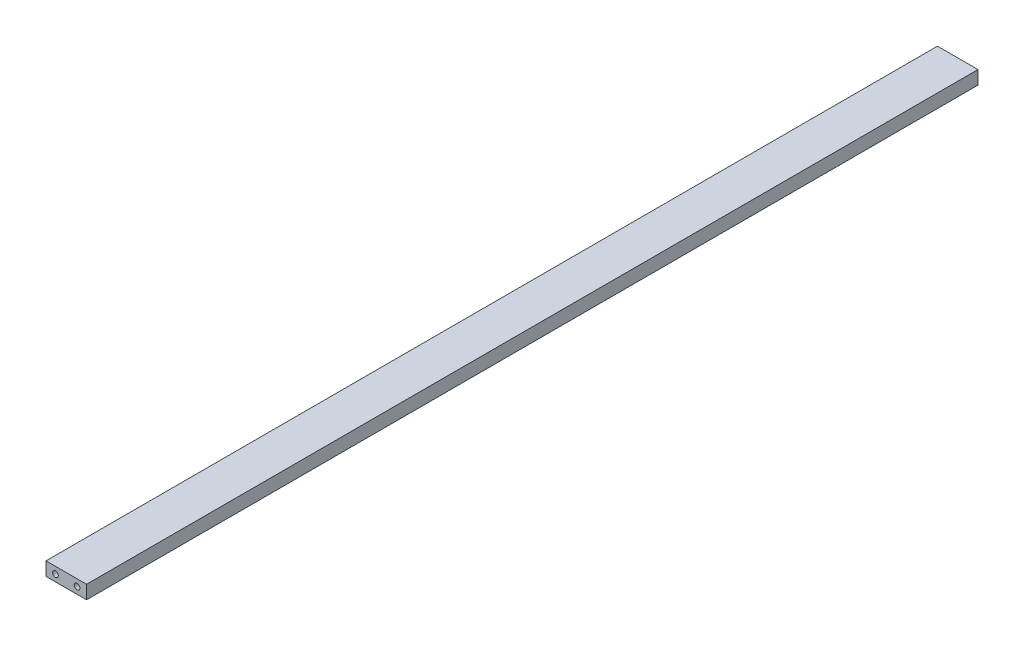
ISO-10303-21;
HEADER;
FILE_DESCRIPTION(('STEP AP214'),'2;1');
FILE_NAME('part.step','',(''),(''),'','','');
FILE_SCHEMA(('AUTOMOTIVE_DESIGN { 1 0 10303 214 1 1 1 1 }'));
ENDSEC;
DATA;
#1=APPLICATION_CONTEXT('core data for automotive mechanical design processes');
#2=APPLICATION_PROTOCOL_DEFINITION('international standard','automotive_design',2000,#1);
#3=PRODUCT_CONTEXT('',#1,'mechanical');
#4=PRODUCT('Part','Part','',(#3));
#5=PRODUCT_RELATED_PRODUCT_CATEGORY('part','',(#4));
#6=PRODUCT_DEFINITION_FORMATION('','',#4);
#7=PRODUCT_DEFINITION_CONTEXT('part definition',#1,'design');
#8=PRODUCT_DEFINITION('design','',#6,#7);
#9=PRODUCT_DEFINITION_SHAPE('','',#8);
#10=(LENGTH_UNIT() NAMED_UNIT(*) SI_UNIT(.MILLI.,.METRE.));
#11=(NAMED_UNIT(*) PLANE_ANGLE_UNIT() SI_UNIT($,.RADIAN.));
#12=(NAMED_UNIT(*) SI_UNIT($,.STERADIAN.) SOLID_ANGLE_UNIT());
#13=UNCERTAINTY_MEASURE_WITH_UNIT(LENGTH_MEASURE(1.E-05),#10,'distance_accuracy_value','');
#14=(GEOMETRIC_REPRESENTATION_CONTEXT(3) GLOBAL_UNCERTAINTY_ASSIGNED_CONTEXT((#13)) GLOBAL_UNIT_ASSIGNED_CONTEXT((#10,
#11,#12)) REPRESENTATION_CONTEXT('',''));
#15=CARTESIAN_POINT('',(0.,0.,0.));
#16=DIRECTION('',(0.,0.,1.));
#17=DIRECTION('',(1.,0.,0.));
#18=AXIS2_PLACEMENT_3D('',#15,#16,#17);
#19=CARTESIAN_POINT('',(-15.,-5.,660.));
#20=DIRECTION('',(1.,0.,0.));
#21=DIRECTION('',(0.,0.,-1.));
#22=AXIS2_PLACEMENT_3D('',#19,#20,#21);
#23=PLANE('',#22);
#24=DIRECTION('',(0.,-1.,0.));
#25=VECTOR('',#24,1.);
#26=CARTESIAN_POINT('',(-15.,-5.,0.));
#27=LINE('',#26,#25);
#28=CARTESIAN_POINT('',(-15.,5.,0.));
#29=VERTEX_POINT('',#28);
#30=CARTESIAN_POINT('',(-15.,-5.,0.));
#31=VERTEX_POINT('',#30);
#32=EDGE_CURVE('E126',#29,#31,#27,.T.);
#33=ORIENTED_EDGE('',*,*,#32,.T.);
#34=DIRECTION('',(0.,0.,-1.));
#35=VECTOR('',#34,1.);
#36=CARTESIAN_POINT('',(-15.,-5.,660.));
#37=LINE('',#36,#35);
#38=CARTESIAN_POINT('',(-15.,-5.,660.));
#39=VERTEX_POINT('',#38);
#40=EDGE_CURVE('E11',#39,#31,#37,.T.);
#41=ORIENTED_EDGE('',*,*,#40,.F.);
#42=DIRECTION('',(0.,-1.,0.));
#43=VECTOR('',#42,1.);
#44=CARTESIAN_POINT('',(-15.,-5.,660.));
#45=LINE('',#44,#43);
#46=CARTESIAN_POINT('',(-15.,5.,660.));
#47=VERTEX_POINT('',#46);
#48=EDGE_CURVE('E127',#47,#39,#45,.T.);
#49=ORIENTED_EDGE('',*,*,#48,.F.);
#50=DIRECTION('',(0.,0.,-1.));
#51=VECTOR('',#50,1.);
#52=CARTESIAN_POINT('',(-15.,5.,660.));
#53=LINE('',#52,#51);
#54=EDGE_CURVE('E133',#47,#29,#53,.T.);
#55=ORIENTED_EDGE('',*,*,#54,.T.);
#56=EDGE_LOOP('',(#33,#41,#49,#55));
#57=FACE_BOUND('',#56,.T.);
#58=ADVANCED_FACE('F33',(#57),#23,.F.);
#59=CARTESIAN_POINT('',(15.,-5.,660.));
#60=DIRECTION('',(0.,1.,0.));
#61=DIRECTION('',(-1.,0.,0.));
#62=AXIS2_PLACEMENT_3D('',#59,#60,#61);
#63=PLANE('',#62);
#64=DIRECTION('',(1.,0.,0.));
#65=VECTOR('',#64,1.);
#66=CARTESIAN_POINT('',(15.,-5.,0.));
#67=LINE('',#66,#65);
#68=CARTESIAN_POINT('',(15.,-5.,0.));
#69=VERTEX_POINT('',#68);
#70=EDGE_CURVE('E136',#31,#69,#67,.T.);
#71=ORIENTED_EDGE('',*,*,#70,.T.);
#72=DIRECTION('',(0.,0.,-1.));
#73=VECTOR('',#72,1.);
#74=CARTESIAN_POINT('',(15.,-5.,660.));
#75=LINE('',#74,#73);
#76=CARTESIAN_POINT('',(15.,-5.,660.));
#77=VERTEX_POINT('',#76);
#78=EDGE_CURVE('E41',#77,#69,#75,.T.);
#79=ORIENTED_EDGE('',*,*,#78,.F.);
#80=DIRECTION('',(1.,0.,0.));
#81=VECTOR('',#80,1.);
#82=CARTESIAN_POINT('',(15.,-5.,660.));
#83=LINE('',#82,#81);
#84=EDGE_CURVE('E80',#39,#77,#83,.T.);
#85=ORIENTED_EDGE('',*,*,#84,.F.);
#86=ORIENTED_EDGE('',*,*,#40,.T.);
#87=EDGE_LOOP('',(#71,#79,#85,#86));
#88=FACE_BOUND('',#87,.T.);
#89=ADVANCED_FACE('F160',(#88),#63,.F.);
#90=CARTESIAN_POINT('',(15.,-5.,660.));
#91=DIRECTION('',(-1.,0.,0.));
#92=DIRECTION('',(0.,0.,1.));
#93=AXIS2_PLACEMENT_3D('',#90,#91,#92);
#94=PLANE('',#93);
#95=DIRECTION('',(0.,1.,0.));
#96=VECTOR('',#95,1.);
#97=CARTESIAN_POINT('',(15.,-5.,0.));
#98=LINE('',#97,#96);
#99=CARTESIAN_POINT('',(15.,5.,0.));
#100=VERTEX_POINT('',#99);
#101=EDGE_CURVE('E67',#69,#100,#98,.T.);
#102=ORIENTED_EDGE('',*,*,#101,.T.);
#103=DIRECTION('',(0.,0.,-1.));
#104=VECTOR('',#103,1.);
#105=CARTESIAN_POINT('',(15.,5.,660.));
#106=LINE('',#105,#104);
#107=CARTESIAN_POINT('',(15.,5.,660.));
#108=VERTEX_POINT('',#107);
#109=EDGE_CURVE('E141',#108,#100,#106,.T.);
#110=ORIENTED_EDGE('',*,*,#109,.F.);
#111=DIRECTION('',(0.,1.,0.));
#112=VECTOR('',#111,1.);
#113=CARTESIAN_POINT('',(15.,-5.,660.));
#114=LINE('',#113,#112);
#115=EDGE_CURVE('E130',#77,#108,#114,.T.);
#116=ORIENTED_EDGE('',*,*,#115,.F.);
#117=ORIENTED_EDGE('',*,*,#78,.T.);
#118=EDGE_LOOP('',(#102,#110,#116,#117));
#119=FACE_BOUND('',#118,.T.);
#120=ADVANCED_FACE('F143',(#119),#94,.F.);
#121=CARTESIAN_POINT('',(15.,5.,660.));
#122=DIRECTION('',(0.,-1.,0.));
#123=DIRECTION('',(1.,0.,0.));
#124=AXIS2_PLACEMENT_3D('',#121,#122,#123);
#125=PLANE('',#124);
#126=DIRECTION('',(-1.,0.,0.));
#127=VECTOR('',#126,1.);
#128=CARTESIAN_POINT('',(15.,5.,0.));
#129=LINE('',#128,#127);
#130=EDGE_CURVE('E73',#100,#29,#129,.T.);
#131=ORIENTED_EDGE('',*,*,#130,.T.);
#132=ORIENTED_EDGE('',*,*,#54,.F.);
#133=DIRECTION('',(-1.,0.,0.));
#134=VECTOR('',#133,1.);
#135=CARTESIAN_POINT('',(15.,5.,660.));
#136=LINE('',#135,#134);
#137=EDGE_CURVE('E49',#108,#47,#136,.T.);
#138=ORIENTED_EDGE('',*,*,#137,.F.);
#139=ORIENTED_EDGE('',*,*,#109,.T.);
#140=EDGE_LOOP('',(#131,#132,#138,#139));
#141=FACE_BOUND('',#140,.T.);
#142=ADVANCED_FACE('F150',(#141),#125,.F.);
#143=CARTESIAN_POINT('',(0.,0.,660.));
#144=DIRECTION('',(0.,0.,1.));
#145=DIRECTION('',(1.,0.,0.));
#146=AXIS2_PLACEMENT_3D('',#143,#144,#145);
#147=PLANE('',#146);
#148=CARTESIAN_POINT('',(-8.,0.,660.));
#149=DIRECTION('',(0.,0.,1.));
#150=DIRECTION('',(1.,0.,0.));
#151=AXIS2_PLACEMENT_3D('',#148,#149,#150);
#152=CIRCLE('',#151,2.09999999999999);
#153=CARTESIAN_POINT('',(-5.90000000000001,0.,660.));
#154=VERTEX_POINT('',#153);
#155=EDGE_CURVE('E104',#154,#154,#152,.T.);
#156=ORIENTED_EDGE('',*,*,#155,.F.);
#157=EDGE_LOOP('',(#156));
#158=FACE_BOUND('',#157,.T.);
#159=CARTESIAN_POINT('',(8.,0.,660.));
#160=DIRECTION('',(0.,0.,1.));
#161=DIRECTION('',(1.,0.,0.));
#162=AXIS2_PLACEMENT_3D('',#159,#160,#161);
#163=CIRCLE('',#162,2.09999999999999);
#164=CARTESIAN_POINT('',(10.1,0.,660.));
#165=VERTEX_POINT('',#164);
#166=EDGE_CURVE('E103',#165,#165,#163,.T.);
#167=ORIENTED_EDGE('',*,*,#166,.F.);
#168=EDGE_LOOP('',(#167));
#169=FACE_BOUND('',#168,.T.);
#170=ORIENTED_EDGE('',*,*,#48,.T.);
#171=ORIENTED_EDGE('',*,*,#84,.T.);
#172=ORIENTED_EDGE('',*,*,#115,.T.);
#173=ORIENTED_EDGE('',*,*,#137,.T.);
#174=EDGE_LOOP('',(#170,#171,#172,#173));
#175=FACE_BOUND('',#174,.T.);
#176=ADVANCED_FACE('F152',(#158,#169,#175),#147,.T.);
#177=CARTESIAN_POINT('',(0.,0.,0.));
#178=DIRECTION('',(0.,0.,1.));
#179=DIRECTION('',(1.,0.,0.));
#180=AXIS2_PLACEMENT_3D('',#177,#178,#179);
#181=PLANE('',#180);
#182=CARTESIAN_POINT('',(-8.,0.,0.));
#183=DIRECTION('',(0.,0.,-1.));
#184=DIRECTION('',(-1.,0.,0.));
#185=AXIS2_PLACEMENT_3D('',#182,#183,#184);
#186=CIRCLE('',#185,2.09999999999999);
#187=CARTESIAN_POINT('',(-10.1,0.,0.));
#188=VERTEX_POINT('',#187);
#189=EDGE_CURVE('E114',#188,#188,#186,.T.);
#190=ORIENTED_EDGE('',*,*,#189,.F.);
#191=EDGE_LOOP('',(#190));
#192=FACE_BOUND('',#191,.T.);
#193=CARTESIAN_POINT('',(8.,0.,0.));
#194=DIRECTION('',(0.,0.,-1.));
#195=DIRECTION('',(-1.,0.,0.));
#196=AXIS2_PLACEMENT_3D('',#193,#194,#195);
#197=CIRCLE('',#196,2.09999999999999);
#198=CARTESIAN_POINT('',(5.90000000000001,0.,0.));
#199=VERTEX_POINT('',#198);
#200=EDGE_CURVE('E120',#199,#199,#197,.T.);
#201=ORIENTED_EDGE('',*,*,#200,.F.);
#202=EDGE_LOOP('',(#201));
#203=FACE_BOUND('',#202,.T.);
#204=ORIENTED_EDGE('',*,*,#32,.F.);
#205=ORIENTED_EDGE('',*,*,#130,.F.);
#206=ORIENTED_EDGE('',*,*,#101,.F.);
#207=ORIENTED_EDGE('',*,*,#70,.F.);
#208=EDGE_LOOP('',(#204,#205,#206,#207));
#209=FACE_BOUND('',#208,.T.);
#210=ADVANCED_FACE('F146',(#192,#203,#209),#181,.F.);
#211=CARTESIAN_POINT('',(8.,0.,17.4));
#212=DIRECTION('',(0.,0.,-1.));
#213=DIRECTION('',(-1.,0.,0.));
#214=AXIS2_PLACEMENT_3D('',#211,#212,#213);
#215=CONICAL_SURFACE('',#214,2.1,1.02974425867665);
#216=CARTESIAN_POINT('',(8.,0.,18.6618072999579));
#217=VERTEX_POINT('',#216);
#218=VERTEX_LOOP('',#217);
#219=FACE_BOUND('',#218,.T.);
#220=CARTESIAN_POINT('',(8.,0.,17.4));
#221=DIRECTION('',(0.,0.,-1.));
#222=DIRECTION('',(-1.,0.,0.));
#223=AXIS2_PLACEMENT_3D('',#220,#221,#222);
#224=CIRCLE('',#223,2.1);
#225=CARTESIAN_POINT('',(5.90000000000001,0.,17.4));
#226=VERTEX_POINT('',#225);
#227=EDGE_CURVE('E123',#226,#226,#224,.T.);
#228=ORIENTED_EDGE('',*,*,#227,.T.);
#229=EDGE_LOOP('',(#228));
#230=FACE_BOUND('',#229,.T.);
#231=ADVANCED_FACE('F187',(#219,#230),#215,.F.);
#232=CARTESIAN_POINT('',(8.,0.,0.));
#233=DIRECTION('',(0.,0.,-1.));
#234=DIRECTION('',(-1.,0.,0.));
#235=AXIS2_PLACEMENT_3D('',#232,#233,#234);
#236=CYLINDRICAL_SURFACE('',#235,2.09999999999999);
#237=ORIENTED_EDGE('',*,*,#227,.F.);
#238=EDGE_LOOP('',(#237));
#239=FACE_BOUND('',#238,.T.);
#240=ORIENTED_EDGE('',*,*,#200,.T.);
#241=EDGE_LOOP('',(#240));
#242=FACE_BOUND('',#241,.T.);
#243=ADVANCED_FACE('F196',(#239,#242),#236,.F.);
#244=CARTESIAN_POINT('',(-8.,0.,17.4));
#245=DIRECTION('',(0.,0.,-1.));
#246=DIRECTION('',(-1.,0.,0.));
#247=AXIS2_PLACEMENT_3D('',#244,#245,#246);
#248=CONICAL_SURFACE('',#247,2.1,1.02974425867665);
#249=CARTESIAN_POINT('',(-8.00000000000001,0.,18.6618072999579));
#250=VERTEX_POINT('',#249);
#251=VERTEX_LOOP('',#250);
#252=FACE_BOUND('',#251,.T.);
#253=CARTESIAN_POINT('',(-8.,0.,17.4));
#254=DIRECTION('',(0.,0.,-1.));
#255=DIRECTION('',(-1.,0.,0.));
#256=AXIS2_PLACEMENT_3D('',#253,#254,#255);
#257=CIRCLE('',#256,2.1);
#258=CARTESIAN_POINT('',(-10.1,0.,17.4));
#259=VERTEX_POINT('',#258);
#260=EDGE_CURVE('E117',#259,#259,#257,.T.);
#261=ORIENTED_EDGE('',*,*,#260,.T.);
#262=EDGE_LOOP('',(#261));
#263=FACE_BOUND('',#262,.T.);
#264=ADVANCED_FACE('F206',(#252,#263),#248,.F.);
#265=CARTESIAN_POINT('',(-8.,0.,0.));
#266=DIRECTION('',(0.,0.,-1.));
#267=DIRECTION('',(-1.,0.,0.));
#268=AXIS2_PLACEMENT_3D('',#265,#266,#267);
#269=CYLINDRICAL_SURFACE('',#268,2.09999999999999);
#270=ORIENTED_EDGE('',*,*,#260,.F.);
#271=EDGE_LOOP('',(#270));
#272=FACE_BOUND('',#271,.T.);
#273=ORIENTED_EDGE('',*,*,#189,.T.);
#274=EDGE_LOOP('',(#273));
#275=FACE_BOUND('',#274,.T.);
#276=ADVANCED_FACE('F216',(#272,#275),#269,.F.);
#277=CARTESIAN_POINT('',(8.,0.,642.6));
#278=DIRECTION('',(0.,0.,1.));
#279=DIRECTION('',(1.,0.,0.));
#280=AXIS2_PLACEMENT_3D('',#277,#278,#279);
#281=CONICAL_SURFACE('',#280,2.09999999999999,1.02974425867662);
#282=CARTESIAN_POINT('',(8.,0.,641.338192700042));
#283=VERTEX_POINT('',#282);
#284=VERTEX_LOOP('',#283);
#285=FACE_BOUND('',#284,.T.);
#286=CARTESIAN_POINT('',(8.,0.,642.6));
#287=DIRECTION('',(0.,0.,1.));
#288=DIRECTION('',(1.,0.,0.));
#289=AXIS2_PLACEMENT_3D('',#286,#287,#288);
#290=CIRCLE('',#289,2.09999999999999);
#291=CARTESIAN_POINT('',(10.1,0.,642.6));
#292=VERTEX_POINT('',#291);
#293=EDGE_CURVE('E107',#292,#292,#290,.T.);
#294=ORIENTED_EDGE('',*,*,#293,.T.);
#295=EDGE_LOOP('',(#294));
#296=FACE_BOUND('',#295,.T.);
#297=ADVANCED_FACE('F226',(#285,#296),#281,.F.);
#298=CARTESIAN_POINT('',(8.,0.,660.));
#299=DIRECTION('',(0.,0.,1.));
#300=DIRECTION('',(1.,0.,0.));
#301=AXIS2_PLACEMENT_3D('',#298,#299,#300);
#302=CYLINDRICAL_SURFACE('',#301,2.09999999999999);
#303=ORIENTED_EDGE('',*,*,#293,.F.);
#304=EDGE_LOOP('',(#303));
#305=FACE_BOUND('',#304,.T.);
#306=ORIENTED_EDGE('',*,*,#166,.T.);
#307=EDGE_LOOP('',(#306));
#308=FACE_BOUND('',#307,.T.);
#309=ADVANCED_FACE('F97',(#305,#308),#302,.F.);
#310=CARTESIAN_POINT('',(-8.,0.,642.6));
#311=DIRECTION('',(0.,0.,1.));
#312=DIRECTION('',(1.,0.,0.));
#313=AXIS2_PLACEMENT_3D('',#310,#311,#312);
#314=CONICAL_SURFACE('',#313,2.09999999999999,1.02974425867662);
#315=CARTESIAN_POINT('',(-8.00000000000001,0.,641.338192700042));
#316=VERTEX_POINT('',#315);
#317=VERTEX_LOOP('',#316);
#318=FACE_BOUND('',#317,.T.);
#319=CARTESIAN_POINT('',(-8.,0.,642.6));
#320=DIRECTION('',(0.,0.,1.));
#321=DIRECTION('',(1.,0.,0.));
#322=AXIS2_PLACEMENT_3D('',#319,#320,#321);
#323=CIRCLE('',#322,2.09999999999999);
#324=CARTESIAN_POINT('',(-5.90000000000001,0.,642.6));
#325=VERTEX_POINT('',#324);
#326=EDGE_CURVE('E101',#325,#325,#323,.T.);
#327=ORIENTED_EDGE('',*,*,#326,.T.);
#328=EDGE_LOOP('',(#327));
#329=FACE_BOUND('',#328,.T.);
#330=ADVANCED_FACE('F93',(#318,#329),#314,.F.);
#331=CARTESIAN_POINT('',(-8.,0.,660.));
#332=DIRECTION('',(0.,0.,1.));
#333=DIRECTION('',(1.,0.,0.));
#334=AXIS2_PLACEMENT_3D('',#331,#332,#333);
#335=CYLINDRICAL_SURFACE('',#334,2.09999999999999);
#336=ORIENTED_EDGE('',*,*,#326,.F.);
#337=EDGE_LOOP('',(#336));
#338=FACE_BOUND('',#337,.T.);
#339=ORIENTED_EDGE('',*,*,#155,.T.);
#340=EDGE_LOOP('',(#339));
#341=FACE_BOUND('',#340,.T.);
#342=ADVANCED_FACE('F96',(#338,#341),#335,.F.);
#343=CLOSED_SHELL('',(#58,#89,#120,#142,#176,#210,#231,#243,#264,#276,#297,#309,#330,#342));
#344=MANIFOLD_SOLID_BREP('B2',#343);
#345=ADVANCED_BREP_SHAPE_REPRESENTATION('',(#18,#344),#14);
#346=SHAPE_DEFINITION_REPRESENTATION(#9,#345);
ENDSEC;
END-ISO-10303-21;
